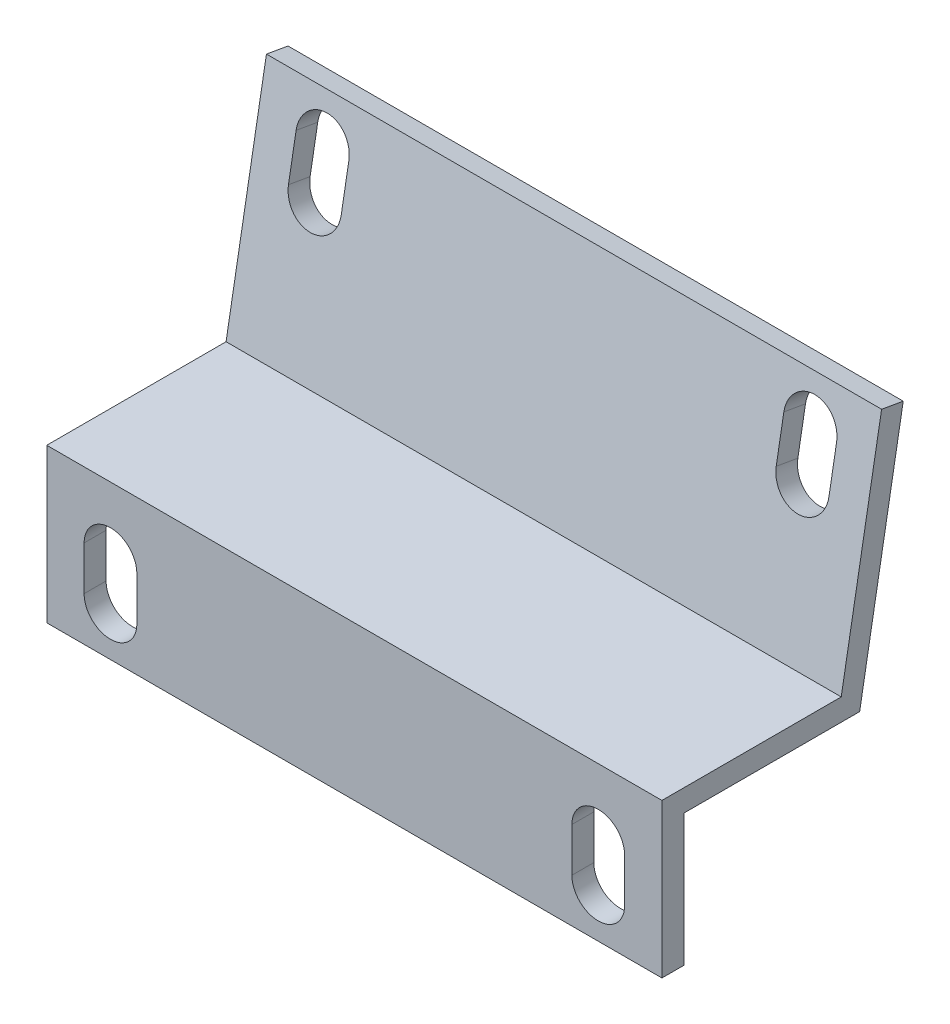
ISO-10303-21;
HEADER;
FILE_DESCRIPTION(('STEP AP214'),'2;1');
FILE_NAME('part.step','',(''),(''),'','','');
FILE_SCHEMA(('AUTOMOTIVE_DESIGN { 1 0 10303 214 1 1 1 1 }'));
ENDSEC;
DATA;
#1=APPLICATION_CONTEXT('core data for automotive mechanical design processes');
#2=APPLICATION_PROTOCOL_DEFINITION('international standard','automotive_design',2000,#1);
#3=PRODUCT_CONTEXT('',#1,'mechanical');
#4=PRODUCT('Part','Part','',(#3));
#5=PRODUCT_RELATED_PRODUCT_CATEGORY('part','',(#4));
#6=PRODUCT_DEFINITION_FORMATION('','',#4);
#7=PRODUCT_DEFINITION_CONTEXT('part definition',#1,'design');
#8=PRODUCT_DEFINITION('design','',#6,#7);
#9=PRODUCT_DEFINITION_SHAPE('','',#8);
#10=(LENGTH_UNIT() NAMED_UNIT(*) SI_UNIT(.MILLI.,.METRE.));
#11=(NAMED_UNIT(*) PLANE_ANGLE_UNIT() SI_UNIT($,.RADIAN.));
#12=(NAMED_UNIT(*) SI_UNIT($,.STERADIAN.) SOLID_ANGLE_UNIT());
#13=UNCERTAINTY_MEASURE_WITH_UNIT(LENGTH_MEASURE(1.E-05),#10,'distance_accuracy_value','');
#14=(GEOMETRIC_REPRESENTATION_CONTEXT(3) GLOBAL_UNCERTAINTY_ASSIGNED_CONTEXT((#13)) GLOBAL_UNIT_ASSIGNED_CONTEXT((#10,
#11,#12)) REPRESENTATION_CONTEXT('',''));
#15=CARTESIAN_POINT('',(0.,0.,0.));
#16=DIRECTION('',(0.,0.,1.));
#17=DIRECTION('',(1.,0.,0.));
#18=AXIS2_PLACEMENT_3D('',#15,#16,#17);
#19=CARTESIAN_POINT('',(70.,0.,0.));
#20=DIRECTION('',(0.,0.,1.));
#21=DIRECTION('',(0.,-1.,0.));
#22=AXIS2_PLACEMENT_3D('',#19,#20,#21);
#23=PLANE('',#22);
#24=DIRECTION('',(0.,-1.,0.));
#25=VECTOR('',#24,1.);
#26=CARTESIAN_POINT('',(4.25,0.,0.));
#27=LINE('',#26,#25);
#28=CARTESIAN_POINT('',(4.25,-5.,0.));
#29=VERTEX_POINT('',#28);
#30=CARTESIAN_POINT('',(4.25,-10.,0.));
#31=VERTEX_POINT('',#30);
#32=EDGE_CURVE('E328',#29,#31,#27,.T.);
#33=ORIENTED_EDGE('',*,*,#32,.T.);
#34=CARTESIAN_POINT('',(7.25,-10.,0.));
#35=DIRECTION('',(0.,0.,1.));
#36=DIRECTION('',(0.,-1.,0.));
#37=AXIS2_PLACEMENT_3D('',#34,#35,#36);
#38=CIRCLE('',#37,3.);
#39=CARTESIAN_POINT('',(10.25,-10.,0.));
#40=VERTEX_POINT('',#39);
#41=EDGE_CURVE('E331',#31,#40,#38,.T.);
#42=ORIENTED_EDGE('',*,*,#41,.T.);
#43=DIRECTION('',(0.,1.,0.));
#44=VECTOR('',#43,1.);
#45=CARTESIAN_POINT('',(10.25,0.,0.));
#46=LINE('',#45,#44);
#47=CARTESIAN_POINT('',(10.25,-5.,0.));
#48=VERTEX_POINT('',#47);
#49=EDGE_CURVE('E322',#40,#48,#46,.T.);
#50=ORIENTED_EDGE('',*,*,#49,.T.);
#51=CARTESIAN_POINT('',(7.25,-5.,0.));
#52=DIRECTION('',(0.,0.,1.));
#53=DIRECTION('',(0.,-1.,0.));
#54=AXIS2_PLACEMENT_3D('',#51,#52,#53);
#55=CIRCLE('',#54,3.);
#56=EDGE_CURVE('E325',#48,#29,#55,.T.);
#57=ORIENTED_EDGE('',*,*,#56,.T.);
#58=EDGE_LOOP('',(#33,#42,#50,#57));
#59=FACE_BOUND('',#58,.T.);
#60=DIRECTION('',(0.,-1.,0.));
#61=VECTOR('',#60,1.);
#62=CARTESIAN_POINT('',(59.75,0.,0.));
#63=LINE('',#62,#61);
#64=CARTESIAN_POINT('',(59.75,-5.,0.));
#65=VERTEX_POINT('',#64);
#66=CARTESIAN_POINT('',(59.75,-10.,0.));
#67=VERTEX_POINT('',#66);
#68=EDGE_CURVE('E316',#65,#67,#63,.T.);
#69=ORIENTED_EDGE('',*,*,#68,.T.);
#70=CARTESIAN_POINT('',(62.75,-10.,0.));
#71=DIRECTION('',(0.,0.,1.));
#72=DIRECTION('',(0.,-1.,0.));
#73=AXIS2_PLACEMENT_3D('',#70,#71,#72);
#74=CIRCLE('',#73,3.);
#75=CARTESIAN_POINT('',(65.75,-10.,0.));
#76=VERTEX_POINT('',#75);
#77=EDGE_CURVE('E319',#67,#76,#74,.T.);
#78=ORIENTED_EDGE('',*,*,#77,.T.);
#79=DIRECTION('',(0.,1.,0.));
#80=VECTOR('',#79,1.);
#81=CARTESIAN_POINT('',(65.75,0.,0.));
#82=LINE('',#81,#80);
#83=CARTESIAN_POINT('',(65.75,-5.,0.));
#84=VERTEX_POINT('',#83);
#85=EDGE_CURVE('E286',#76,#84,#82,.T.);
#86=ORIENTED_EDGE('',*,*,#85,.T.);
#87=CARTESIAN_POINT('',(62.75,-5.,0.));
#88=DIRECTION('',(0.,0.,1.));
#89=DIRECTION('',(0.,-1.,0.));
#90=AXIS2_PLACEMENT_3D('',#87,#88,#89);
#91=CIRCLE('',#90,3.);
#92=EDGE_CURVE('E313',#84,#65,#91,.T.);
#93=ORIENTED_EDGE('',*,*,#92,.T.);
#94=EDGE_LOOP('',(#69,#78,#86,#93));
#95=FACE_BOUND('',#94,.T.);
#96=DIRECTION('',(0.,1.,0.));
#97=VECTOR('',#96,1.);
#98=CARTESIAN_POINT('',(0.,0.,0.));
#99=LINE('',#98,#97);
#100=CARTESIAN_POINT('',(0.,-15.,0.));
#101=VERTEX_POINT('',#100);
#102=CARTESIAN_POINT('',(0.,0.,0.));
#103=VERTEX_POINT('',#102);
#104=EDGE_CURVE('E334',#101,#103,#99,.T.);
#105=ORIENTED_EDGE('',*,*,#104,.T.);
#106=DIRECTION('',(-1.,0.,0.));
#107=VECTOR('',#106,1.);
#108=CARTESIAN_POINT('',(70.,0.,0.));
#109=LINE('',#108,#107);
#110=CARTESIAN_POINT('',(70.,0.,0.));
#111=VERTEX_POINT('',#110);
#112=EDGE_CURVE('E11',#111,#103,#109,.T.);
#113=ORIENTED_EDGE('',*,*,#112,.F.);
#114=DIRECTION('',(0.,1.,0.));
#115=VECTOR('',#114,1.);
#116=CARTESIAN_POINT('',(70.,0.,0.));
#117=LINE('',#116,#115);
#118=CARTESIAN_POINT('',(70.,-15.,0.));
#119=VERTEX_POINT('',#118);
#120=EDGE_CURVE('E335',#119,#111,#117,.T.);
#121=ORIENTED_EDGE('',*,*,#120,.F.);
#122=DIRECTION('',(-1.,0.,0.));
#123=VECTOR('',#122,1.);
#124=CARTESIAN_POINT('',(70.,-15.,0.));
#125=LINE('',#124,#123);
#126=EDGE_CURVE('E353',#119,#101,#125,.T.);
#127=ORIENTED_EDGE('',*,*,#126,.T.);
#128=EDGE_LOOP('',(#105,#113,#121,#127));
#129=FACE_BOUND('',#128,.T.);
#130=ADVANCED_FACE('F41',(#59,#95,#129),#23,.F.);
#131=CARTESIAN_POINT('',(70.,0.,0.));
#132=DIRECTION('',(0.,1.,0.));
#133=DIRECTION('',(0.,0.,1.));
#134=AXIS2_PLACEMENT_3D('',#131,#132,#133);
#135=PLANE('',#134);
#136=DIRECTION('',(0.,0.,-1.));
#137=VECTOR('',#136,1.);
#138=CARTESIAN_POINT('',(0.,0.,0.));
#139=LINE('',#138,#137);
#140=CARTESIAN_POINT('',(0.,0.,-20.));
#141=VERTEX_POINT('',#140);
#142=EDGE_CURVE('E356',#103,#141,#139,.T.);
#143=ORIENTED_EDGE('',*,*,#142,.T.);
#144=DIRECTION('',(-1.,0.,0.));
#145=VECTOR('',#144,1.);
#146=CARTESIAN_POINT('',(70.,0.,-20.));
#147=LINE('',#146,#145);
#148=CARTESIAN_POINT('',(70.,0.,-20.));
#149=VERTEX_POINT('',#148);
#150=EDGE_CURVE('E48',#149,#141,#147,.T.);
#151=ORIENTED_EDGE('',*,*,#150,.F.);
#152=DIRECTION('',(0.,0.,-1.));
#153=VECTOR('',#152,1.);
#154=CARTESIAN_POINT('',(70.,0.,0.));
#155=LINE('',#154,#153);
#156=EDGE_CURVE('E338',#111,#149,#155,.T.);
#157=ORIENTED_EDGE('',*,*,#156,.F.);
#158=ORIENTED_EDGE('',*,*,#112,.T.);
#159=EDGE_LOOP('',(#143,#151,#157,#158));
#160=FACE_BOUND('',#159,.T.);
#161=ADVANCED_FACE('F412',(#160),#135,.F.);
#162=CARTESIAN_POINT('',(70.,0.,-20.));
#163=DIRECTION('',(0.,0.173648177666934,0.984807753012208));
#164=DIRECTION('',(0.,-0.984807753012208,0.173648177666934));
#165=AXIS2_PLACEMENT_3D('',#162,#163,#164);
#166=PLANE('',#165);
#167=CARTESIAN_POINT('',(7.25,23.1645389360579,-24.0845332100989));
#168=DIRECTION('',(0.,0.173648177666934,0.984807753012208));
#169=DIRECTION('',(0.,-0.984807753012208,0.173648177666934));
#170=AXIS2_PLACEMENT_3D('',#167,#168,#169);
#171=CIRCLE('',#170,3.);
#172=CARTESIAN_POINT('',(10.25,23.1645389360579,-24.0845332100989));
#173=VERTEX_POINT('',#172);
#174=CARTESIAN_POINT('',(4.25,23.1645389360579,-24.0845332100989));
#175=VERTEX_POINT('',#174);
#176=EDGE_CURVE('E264',#173,#175,#171,.T.);
#177=ORIENTED_EDGE('',*,*,#176,.T.);
#178=DIRECTION('',(0.,-0.984807753012207,0.173648177666934));
#179=VECTOR('',#178,1.);
#180=CARTESIAN_POINT('',(4.25,0.,-20.));
#181=LINE('',#180,#179);
#182=CARTESIAN_POINT('',(4.25,18.2405001709969,-23.2162923217642));
#183=VERTEX_POINT('',#182);
#184=EDGE_CURVE('E267',#175,#183,#181,.T.);
#185=ORIENTED_EDGE('',*,*,#184,.T.);
#186=CARTESIAN_POINT('',(7.25,18.2405001709969,-23.2162923217642));
#187=DIRECTION('',(0.,0.173648177666934,0.984807753012208));
#188=DIRECTION('',(0.,-0.984807753012208,0.173648177666934));
#189=AXIS2_PLACEMENT_3D('',#186,#187,#188);
#190=CIRCLE('',#189,3.);
#191=CARTESIAN_POINT('',(10.25,18.2405001709969,-23.2162923217642));
#192=VERTEX_POINT('',#191);
#193=EDGE_CURVE('E261',#183,#192,#190,.T.);
#194=ORIENTED_EDGE('',*,*,#193,.T.);
#195=DIRECTION('',(0.,-0.984807753012207,0.173648177666934));
#196=VECTOR('',#195,1.);
#197=CARTESIAN_POINT('',(10.25,0.,-20.));
#198=LINE('',#197,#196);
#199=EDGE_CURVE('E206',#173,#192,#198,.T.);
#200=ORIENTED_EDGE('',*,*,#199,.F.);
#201=EDGE_LOOP('',(#177,#185,#194,#200));
#202=FACE_BOUND('',#201,.T.);
#203=CARTESIAN_POINT('',(62.75,23.1645389360579,-24.0845332100989));
#204=DIRECTION('',(0.,0.173648177666934,0.984807753012208));
#205=DIRECTION('',(0.,-0.984807753012208,0.173648177666934));
#206=AXIS2_PLACEMENT_3D('',#203,#204,#205);
#207=CIRCLE('',#206,3.);
#208=CARTESIAN_POINT('',(65.75,23.1645389360579,-24.0845332100989));
#209=VERTEX_POINT('',#208);
#210=CARTESIAN_POINT('',(59.75,23.1645389360579,-24.0845332100989));
#211=VERTEX_POINT('',#210);
#212=EDGE_CURVE('E255',#209,#211,#207,.T.);
#213=ORIENTED_EDGE('',*,*,#212,.T.);
#214=DIRECTION('',(0.,-0.984807753012207,0.173648177666934));
#215=VECTOR('',#214,1.);
#216=CARTESIAN_POINT('',(59.75,0.,-20.));
#217=LINE('',#216,#215);
#218=CARTESIAN_POINT('',(59.75,18.2405001709969,-23.2162923217642));
#219=VERTEX_POINT('',#218);
#220=EDGE_CURVE('E258',#211,#219,#217,.T.);
#221=ORIENTED_EDGE('',*,*,#220,.T.);
#222=CARTESIAN_POINT('',(62.75,18.2405001709969,-23.2162923217642));
#223=DIRECTION('',(0.,0.173648177666934,0.984807753012208));
#224=DIRECTION('',(0.,-0.984807753012208,0.173648177666934));
#225=AXIS2_PLACEMENT_3D('',#222,#223,#224);
#226=CIRCLE('',#225,3.);
#227=CARTESIAN_POINT('',(65.75,18.2405001709969,-23.2162923217642));
#228=VERTEX_POINT('',#227);
#229=EDGE_CURVE('E230',#219,#228,#226,.T.);
#230=ORIENTED_EDGE('',*,*,#229,.T.);
#231=DIRECTION('',(0.,-0.984807753012207,0.173648177666934));
#232=VECTOR('',#231,1.);
#233=CARTESIAN_POINT('',(65.75,0.,-20.));
#234=LINE('',#233,#232);
#235=EDGE_CURVE('E253',#209,#228,#234,.T.);
#236=ORIENTED_EDGE('',*,*,#235,.F.);
#237=EDGE_LOOP('',(#213,#221,#230,#236));
#238=FACE_BOUND('',#237,.T.);
#239=DIRECTION('',(0.,0.984807753012208,-0.173648177666934));
#240=VECTOR('',#239,1.);
#241=CARTESIAN_POINT('',(0.,0.,-20.));
#242=LINE('',#241,#240);
#243=CARTESIAN_POINT('',(0.,28.115152985752,-24.9574600381344));
#244=VERTEX_POINT('',#243);
#245=EDGE_CURVE('E358',#141,#244,#242,.T.);
#246=ORIENTED_EDGE('',*,*,#245,.T.);
#247=DIRECTION('',(-1.,0.,0.));
#248=VECTOR('',#247,1.);
#249=CARTESIAN_POINT('',(70.,28.115152985752,-24.9574600381344));
#250=LINE('',#249,#248);
#251=CARTESIAN_POINT('',(70.,28.115152985752,-24.9574600381344));
#252=VERTEX_POINT('',#251);
#253=EDGE_CURVE('E383',#252,#244,#250,.T.);
#254=ORIENTED_EDGE('',*,*,#253,.F.);
#255=DIRECTION('',(0.,0.984807753012208,-0.173648177666934));
#256=VECTOR('',#255,1.);
#257=CARTESIAN_POINT('',(70.,0.,-20.));
#258=LINE('',#257,#256);
#259=EDGE_CURVE('E341',#149,#252,#258,.T.);
#260=ORIENTED_EDGE('',*,*,#259,.F.);
#261=ORIENTED_EDGE('',*,*,#150,.T.);
#262=EDGE_LOOP('',(#246,#254,#260,#261));
#263=FACE_BOUND('',#262,.T.);
#264=ADVANCED_FACE('F390',(#202,#238,#263),#166,.F.);
#265=CARTESIAN_POINT('',(70.,28.5492734299194,-22.4954406556038));
#266=DIRECTION('',(0.,-0.984807753012208,0.173648177666932));
#267=DIRECTION('',(0.,-0.173648177666932,-0.984807753012208));
#268=AXIS2_PLACEMENT_3D('',#265,#266,#267);
#269=PLANE('',#268);
#270=DIRECTION('',(0.,0.173648177666932,0.984807753012208));
#271=VECTOR('',#270,1.);
#272=CARTESIAN_POINT('',(0.,28.5492734299194,-22.4954406556038));
#273=LINE('',#272,#271);
#274=CARTESIAN_POINT('',(0.,28.5492734299194,-22.4954406556038));
#275=VERTEX_POINT('',#274);
#276=EDGE_CURVE('E360',#244,#275,#273,.T.);
#277=ORIENTED_EDGE('',*,*,#276,.T.);
#278=DIRECTION('',(-1.,0.,0.));
#279=VECTOR('',#278,1.);
#280=CARTESIAN_POINT('',(70.,28.5492734299194,-22.4954406556038));
#281=LINE('',#280,#279);
#282=CARTESIAN_POINT('',(70.,28.5492734299194,-22.4954406556038));
#283=VERTEX_POINT('',#282);
#284=EDGE_CURVE('E380',#283,#275,#281,.T.);
#285=ORIENTED_EDGE('',*,*,#284,.F.);
#286=DIRECTION('',(0.,0.173648177666932,0.984807753012208));
#287=VECTOR('',#286,1.);
#288=CARTESIAN_POINT('',(70.,28.5492734299194,-22.4954406556038));
#289=LINE('',#288,#287);
#290=EDGE_CURVE('E343',#252,#283,#289,.T.);
#291=ORIENTED_EDGE('',*,*,#290,.F.);
#292=ORIENTED_EDGE('',*,*,#253,.T.);
#293=EDGE_LOOP('',(#277,#285,#291,#292));
#294=FACE_BOUND('',#293,.T.);
#295=ADVANCED_FACE('F401',(#294),#269,.F.);
#296=CARTESIAN_POINT('',(70.,2.5,-17.9022509220568));
#297=DIRECTION('',(0.,-0.173648177666934,-0.984807753012208));
#298=DIRECTION('',(0.,0.984807753012208,-0.173648177666934));
#299=AXIS2_PLACEMENT_3D('',#296,#297,#298);
#300=PLANE('',#299);
#301=CARTESIAN_POINT('',(7.25,18.6746206151642,-20.7542729392337));
#302=DIRECTION('',(0.,0.173648177666934,0.984807753012208));
#303=DIRECTION('',(0.,-0.984807753012208,0.173648177666934));
#304=AXIS2_PLACEMENT_3D('',#301,#302,#303);
#305=CIRCLE('',#304,3.);
#306=CARTESIAN_POINT('',(4.25,18.6746206151642,-20.7542729392337));
#307=VERTEX_POINT('',#306);
#308=CARTESIAN_POINT('',(10.25,18.6746206151642,-20.7542729392337));
#309=VERTEX_POINT('',#308);
#310=EDGE_CURVE('E213',#307,#309,#305,.T.);
#311=ORIENTED_EDGE('',*,*,#310,.F.);
#312=DIRECTION('',(0.,-0.984807753012208,0.173648177666934));
#313=VECTOR('',#312,1.);
#314=CARTESIAN_POINT('',(4.25,-2.98608098908942,-16.9349068253286));
#315=LINE('',#314,#313);
#316=CARTESIAN_POINT('',(4.25,23.5986593802252,-21.6225138275684));
#317=VERTEX_POINT('',#316);
#318=EDGE_CURVE('E218',#317,#307,#315,.T.);
#319=ORIENTED_EDGE('',*,*,#318,.F.);
#320=CARTESIAN_POINT('',(7.25,23.5986593802252,-21.6225138275683));
#321=DIRECTION('',(0.,0.173648177666934,0.984807753012208));
#322=DIRECTION('',(0.,-0.984807753012208,0.173648177666934));
#323=AXIS2_PLACEMENT_3D('',#320,#321,#322);
#324=CIRCLE('',#323,3.);
#325=CARTESIAN_POINT('',(10.25,23.5986593802252,-21.6225138275684));
#326=VERTEX_POINT('',#325);
#327=EDGE_CURVE('E223',#326,#317,#324,.T.);
#328=ORIENTED_EDGE('',*,*,#327,.F.);
#329=DIRECTION('',(0.,-0.984807753012208,0.173648177666934));
#330=VECTOR('',#329,1.);
#331=CARTESIAN_POINT('',(10.25,-2.98608098908942,-16.9349068253286));
#332=LINE('',#331,#330);
#333=EDGE_CURVE('E203',#326,#309,#332,.T.);
#334=ORIENTED_EDGE('',*,*,#333,.T.);
#335=EDGE_LOOP('',(#311,#319,#328,#334));
#336=FACE_BOUND('',#335,.T.);
#337=CARTESIAN_POINT('',(62.75,18.6746206151642,-20.7542729392337));
#338=DIRECTION('',(0.,0.173648177666934,0.984807753012208));
#339=DIRECTION('',(0.,-0.984807753012208,0.173648177666934));
#340=AXIS2_PLACEMENT_3D('',#337,#338,#339);
#341=CIRCLE('',#340,3.);
#342=CARTESIAN_POINT('',(59.75,18.6746206151642,-20.7542729392337));
#343=VERTEX_POINT('',#342);
#344=CARTESIAN_POINT('',(65.75,18.6746206151642,-20.7542729392337));
#345=VERTEX_POINT('',#344);
#346=EDGE_CURVE('E235',#343,#345,#341,.T.);
#347=ORIENTED_EDGE('',*,*,#346,.F.);
#348=DIRECTION('',(0.,-0.984807753012208,0.173648177666934));
#349=VECTOR('',#348,1.);
#350=CARTESIAN_POINT('',(59.75,-2.98608098908942,-16.9349068253286));
#351=LINE('',#350,#349);
#352=CARTESIAN_POINT('',(59.75,23.5986593802252,-21.6225138275684));
#353=VERTEX_POINT('',#352);
#354=EDGE_CURVE('E233',#353,#343,#351,.T.);
#355=ORIENTED_EDGE('',*,*,#354,.F.);
#356=CARTESIAN_POINT('',(62.75,23.5986593802252,-21.6225138275683));
#357=DIRECTION('',(0.,0.173648177666934,0.984807753012208));
#358=DIRECTION('',(0.,-0.984807753012208,0.173648177666934));
#359=AXIS2_PLACEMENT_3D('',#356,#357,#358);
#360=CIRCLE('',#359,3.);
#361=CARTESIAN_POINT('',(65.75,23.5986593802252,-21.6225138275684));
#362=VERTEX_POINT('',#361);
#363=EDGE_CURVE('E240',#362,#353,#360,.T.);
#364=ORIENTED_EDGE('',*,*,#363,.F.);
#365=DIRECTION('',(0.,-0.984807753012208,0.173648177666934));
#366=VECTOR('',#365,1.);
#367=CARTESIAN_POINT('',(65.75,-2.98608098908942,-16.9349068253286));
#368=LINE('',#367,#366);
#369=EDGE_CURVE('E237',#362,#345,#368,.T.);
#370=ORIENTED_EDGE('',*,*,#369,.T.);
#371=EDGE_LOOP('',(#347,#355,#364,#370));
#372=FACE_BOUND('',#371,.T.);
#373=DIRECTION('',(0.,-0.984807753012207,0.173648177666934));
#374=VECTOR('',#373,1.);
#375=CARTESIAN_POINT('',(0.,2.5,-17.9022509220568));
#376=LINE('',#375,#374);
#377=CARTESIAN_POINT('',(0.,2.5,-17.9022509220568));
#378=VERTEX_POINT('',#377);
#379=EDGE_CURVE('E362',#275,#378,#376,.T.);
#380=ORIENTED_EDGE('',*,*,#379,.T.);
#381=DIRECTION('',(-1.,0.,0.));
#382=VECTOR('',#381,1.);
#383=CARTESIAN_POINT('',(70.,2.5,-17.9022509220568));
#384=LINE('',#383,#382);
#385=CARTESIAN_POINT('',(70.,2.5,-17.9022509220568));
#386=VERTEX_POINT('',#385);
#387=EDGE_CURVE('E377',#386,#378,#384,.T.);
#388=ORIENTED_EDGE('',*,*,#387,.F.);
#389=DIRECTION('',(0.,-0.984807753012207,0.173648177666934));
#390=VECTOR('',#389,1.);
#391=CARTESIAN_POINT('',(70.,2.5,-17.9022509220568));
#392=LINE('',#391,#390);
#393=EDGE_CURVE('E345',#283,#386,#392,.T.);
#394=ORIENTED_EDGE('',*,*,#393,.F.);
#395=ORIENTED_EDGE('',*,*,#284,.T.);
#396=EDGE_LOOP('',(#380,#388,#394,#395));
#397=FACE_BOUND('',#396,.T.);
#398=ADVANCED_FACE('F220',(#336,#372,#397),#300,.F.);
#399=CARTESIAN_POINT('',(70.,2.5,2.5));
#400=DIRECTION('',(0.,-1.,0.));
#401=DIRECTION('',(0.,0.,-1.));
#402=AXIS2_PLACEMENT_3D('',#399,#400,#401);
#403=PLANE('',#402);
#404=DIRECTION('',(0.,0.,1.));
#405=VECTOR('',#404,1.);
#406=CARTESIAN_POINT('',(0.,2.5,2.5));
#407=LINE('',#406,#405);
#408=CARTESIAN_POINT('',(0.,2.5,2.5));
#409=VERTEX_POINT('',#408);
#410=EDGE_CURVE('E364',#378,#409,#407,.T.);
#411=ORIENTED_EDGE('',*,*,#410,.T.);
#412=DIRECTION('',(-1.,0.,0.));
#413=VECTOR('',#412,1.);
#414=CARTESIAN_POINT('',(70.,2.5,2.5));
#415=LINE('',#414,#413);
#416=CARTESIAN_POINT('',(70.,2.5,2.5));
#417=VERTEX_POINT('',#416);
#418=EDGE_CURVE('E374',#417,#409,#415,.T.);
#419=ORIENTED_EDGE('',*,*,#418,.F.);
#420=DIRECTION('',(0.,0.,1.));
#421=VECTOR('',#420,1.);
#422=CARTESIAN_POINT('',(70.,2.5,2.5));
#423=LINE('',#422,#421);
#424=EDGE_CURVE('E347',#386,#417,#423,.T.);
#425=ORIENTED_EDGE('',*,*,#424,.F.);
#426=ORIENTED_EDGE('',*,*,#387,.T.);
#427=EDGE_LOOP('',(#411,#419,#425,#426));
#428=FACE_BOUND('',#427,.T.);
#429=ADVANCED_FACE('F425',(#428),#403,.F.);
#430=CARTESIAN_POINT('',(70.,2.5,2.5));
#431=DIRECTION('',(0.,0.,-1.));
#432=DIRECTION('',(0.,1.,0.));
#433=AXIS2_PLACEMENT_3D('',#430,#431,#432);
#434=PLANE('',#433);
#435=DIRECTION('',(0.,1.,0.));
#436=VECTOR('',#435,1.);
#437=CARTESIAN_POINT('',(10.25,-10.,2.5));
#438=LINE('',#437,#436);
#439=CARTESIAN_POINT('',(10.25,-10.,2.5));
#440=VERTEX_POINT('',#439);
#441=CARTESIAN_POINT('',(10.25,-5.,2.5));
#442=VERTEX_POINT('',#441);
#443=EDGE_CURVE('E273',#440,#442,#438,.T.);
#444=ORIENTED_EDGE('',*,*,#443,.F.);
#445=CARTESIAN_POINT('',(7.25,-10.,2.5));
#446=DIRECTION('',(0.,0.,1.));
#447=DIRECTION('',(1.,0.,0.));
#448=AXIS2_PLACEMENT_3D('',#445,#446,#447);
#449=CIRCLE('',#448,3.);
#450=CARTESIAN_POINT('',(4.25,-10.,2.5));
#451=VERTEX_POINT('',#450);
#452=EDGE_CURVE('E271',#451,#440,#449,.T.);
#453=ORIENTED_EDGE('',*,*,#452,.F.);
#454=DIRECTION('',(0.,-1.,0.));
#455=VECTOR('',#454,1.);
#456=CARTESIAN_POINT('',(4.25,-10.,2.5));
#457=LINE('',#456,#455);
#458=CARTESIAN_POINT('',(4.25,-5.,2.5));
#459=VERTEX_POINT('',#458);
#460=EDGE_CURVE('E280',#459,#451,#457,.T.);
#461=ORIENTED_EDGE('',*,*,#460,.F.);
#462=CARTESIAN_POINT('',(7.25,-5.,2.5));
#463=DIRECTION('',(0.,0.,1.));
#464=DIRECTION('',(1.,0.,0.));
#465=AXIS2_PLACEMENT_3D('',#462,#463,#464);
#466=CIRCLE('',#465,3.);
#467=EDGE_CURVE('E277',#442,#459,#466,.T.);
#468=ORIENTED_EDGE('',*,*,#467,.F.);
#469=EDGE_LOOP('',(#444,#453,#461,#468));
#470=FACE_BOUND('',#469,.T.);
#471=DIRECTION('',(0.,1.,0.));
#472=VECTOR('',#471,1.);
#473=CARTESIAN_POINT('',(65.75,-10.,2.5));
#474=LINE('',#473,#472);
#475=CARTESIAN_POINT('',(65.75,-10.,2.5));
#476=VERTEX_POINT('',#475);
#477=CARTESIAN_POINT('',(65.75,-5.,2.5));
#478=VERTEX_POINT('',#477);
#479=EDGE_CURVE('E307',#476,#478,#474,.T.);
#480=ORIENTED_EDGE('',*,*,#479,.F.);
#481=CARTESIAN_POINT('',(62.75,-10.,2.5));
#482=DIRECTION('',(0.,0.,1.));
#483=DIRECTION('',(-1.,0.,0.));
#484=AXIS2_PLACEMENT_3D('',#481,#482,#483);
#485=CIRCLE('',#484,3.);
#486=CARTESIAN_POINT('',(59.75,-10.,2.5));
#487=VERTEX_POINT('',#486);
#488=EDGE_CURVE('E274',#487,#476,#485,.T.);
#489=ORIENTED_EDGE('',*,*,#488,.F.);
#490=DIRECTION('',(0.,-1.,0.));
#491=VECTOR('',#490,1.);
#492=CARTESIAN_POINT('',(59.75,-10.,2.5));
#493=LINE('',#492,#491);
#494=CARTESIAN_POINT('',(59.75,-5.,2.5));
#495=VERTEX_POINT('',#494);
#496=EDGE_CURVE('E296',#495,#487,#493,.T.);
#497=ORIENTED_EDGE('',*,*,#496,.F.);
#498=CARTESIAN_POINT('',(62.75,-5.,2.5));
#499=DIRECTION('',(0.,0.,1.));
#500=DIRECTION('',(-1.,0.,0.));
#501=AXIS2_PLACEMENT_3D('',#498,#499,#500);
#502=CIRCLE('',#501,3.);
#503=EDGE_CURVE('E304',#478,#495,#502,.T.);
#504=ORIENTED_EDGE('',*,*,#503,.F.);
#505=EDGE_LOOP('',(#480,#489,#497,#504));
#506=FACE_BOUND('',#505,.T.);
#507=DIRECTION('',(0.,-1.,0.));
#508=VECTOR('',#507,1.);
#509=CARTESIAN_POINT('',(0.,2.5,2.5));
#510=LINE('',#509,#508);
#511=CARTESIAN_POINT('',(0.,-15.,2.5));
#512=VERTEX_POINT('',#511);
#513=EDGE_CURVE('E366',#409,#512,#510,.T.);
#514=ORIENTED_EDGE('',*,*,#513,.T.);
#515=DIRECTION('',(-1.,0.,0.));
#516=VECTOR('',#515,1.);
#517=CARTESIAN_POINT('',(70.,-15.,2.5));
#518=LINE('',#517,#516);
#519=CARTESIAN_POINT('',(70.,-15.,2.5));
#520=VERTEX_POINT('',#519);
#521=EDGE_CURVE('E371',#520,#512,#518,.T.);
#522=ORIENTED_EDGE('',*,*,#521,.F.);
#523=DIRECTION('',(0.,-1.,0.));
#524=VECTOR('',#523,1.);
#525=CARTESIAN_POINT('',(70.,2.5,2.5));
#526=LINE('',#525,#524);
#527=EDGE_CURVE('E349',#417,#520,#526,.T.);
#528=ORIENTED_EDGE('',*,*,#527,.F.);
#529=ORIENTED_EDGE('',*,*,#418,.T.);
#530=EDGE_LOOP('',(#514,#522,#528,#529));
#531=FACE_BOUND('',#530,.T.);
#532=ADVANCED_FACE('F423',(#470,#506,#531),#434,.F.);
#533=CARTESIAN_POINT('',(70.,-15.,2.5));
#534=DIRECTION('',(0.,1.,0.));
#535=DIRECTION('',(0.,0.,1.));
#536=AXIS2_PLACEMENT_3D('',#533,#534,#535);
#537=PLANE('',#536);
#538=DIRECTION('',(0.,0.,-1.));
#539=VECTOR('',#538,1.);
#540=CARTESIAN_POINT('',(0.,-15.,2.5));
#541=LINE('',#540,#539);
#542=EDGE_CURVE('E339',#512,#101,#541,.T.);
#543=ORIENTED_EDGE('',*,*,#542,.T.);
#544=ORIENTED_EDGE('',*,*,#126,.F.);
#545=DIRECTION('',(0.,0.,-1.));
#546=VECTOR('',#545,1.);
#547=CARTESIAN_POINT('',(70.,-15.,2.5));
#548=LINE('',#547,#546);
#549=EDGE_CURVE('E351',#520,#119,#548,.T.);
#550=ORIENTED_EDGE('',*,*,#549,.F.);
#551=ORIENTED_EDGE('',*,*,#521,.T.);
#552=EDGE_LOOP('',(#543,#544,#550,#551));
#553=FACE_BOUND('',#552,.T.);
#554=ADVANCED_FACE('F418',(#553),#537,.F.);
#555=CARTESIAN_POINT('',(70.,0.,0.));
#556=DIRECTION('',(1.,0.,0.));
#557=DIRECTION('',(0.,0.,-1.));
#558=AXIS2_PLACEMENT_3D('',#555,#556,#557);
#559=PLANE('',#558);
#560=ORIENTED_EDGE('',*,*,#120,.T.);
#561=ORIENTED_EDGE('',*,*,#156,.T.);
#562=ORIENTED_EDGE('',*,*,#259,.T.);
#563=ORIENTED_EDGE('',*,*,#290,.T.);
#564=ORIENTED_EDGE('',*,*,#393,.T.);
#565=ORIENTED_EDGE('',*,*,#424,.T.);
#566=ORIENTED_EDGE('',*,*,#527,.T.);
#567=ORIENTED_EDGE('',*,*,#549,.T.);
#568=EDGE_LOOP('',(#560,#561,#562,#563,#564,#565,#566,#567));
#569=FACE_BOUND('',#568,.T.);
#570=ADVANCED_FACE('F408',(#569),#559,.T.);
#571=CARTESIAN_POINT('',(0.,0.,0.));
#572=DIRECTION('',(1.,0.,0.));
#573=DIRECTION('',(0.,0.,-1.));
#574=AXIS2_PLACEMENT_3D('',#571,#572,#573);
#575=PLANE('',#574);
#576=ORIENTED_EDGE('',*,*,#104,.F.);
#577=ORIENTED_EDGE('',*,*,#542,.F.);
#578=ORIENTED_EDGE('',*,*,#513,.F.);
#579=ORIENTED_EDGE('',*,*,#410,.F.);
#580=ORIENTED_EDGE('',*,*,#379,.F.);
#581=ORIENTED_EDGE('',*,*,#276,.F.);
#582=ORIENTED_EDGE('',*,*,#245,.F.);
#583=ORIENTED_EDGE('',*,*,#142,.F.);
#584=EDGE_LOOP('',(#576,#577,#578,#579,#580,#581,#582,#583));
#585=FACE_BOUND('',#584,.T.);
#586=ADVANCED_FACE('F396',(#585),#575,.F.);
#587=CARTESIAN_POINT('',(62.75,-10.,-67.5));
#588=DIRECTION('',(0.,0.,1.));
#589=DIRECTION('',(1.,0.,0.));
#590=AXIS2_PLACEMENT_3D('',#587,#588,#589);
#591=CYLINDRICAL_SURFACE('',#590,3.);
#592=DIRECTION('',(0.,0.,1.));
#593=VECTOR('',#592,1.);
#594=CARTESIAN_POINT('',(59.75,-10.,-67.5));
#595=LINE('',#594,#593);
#596=EDGE_CURVE('E270',#67,#487,#595,.T.);
#597=ORIENTED_EDGE('',*,*,#596,.T.);
#598=ORIENTED_EDGE('',*,*,#488,.T.);
#599=DIRECTION('',(0.,0.,1.));
#600=VECTOR('',#599,1.);
#601=CARTESIAN_POINT('',(65.75,-10.,-67.5));
#602=LINE('',#601,#600);
#603=EDGE_CURVE('E293',#76,#476,#602,.T.);
#604=ORIENTED_EDGE('',*,*,#603,.F.);
#605=ORIENTED_EDGE('',*,*,#77,.F.);
#606=EDGE_LOOP('',(#597,#598,#604,#605));
#607=FACE_BOUND('',#606,.T.);
#608=ADVANCED_FACE('F458',(#607),#591,.F.);
#609=CARTESIAN_POINT('',(59.75,-10.,-67.5));
#610=DIRECTION('',(-1.,0.,0.));
#611=DIRECTION('',(0.,-1.,0.));
#612=AXIS2_PLACEMENT_3D('',#609,#610,#611);
#613=PLANE('',#612);
#614=DIRECTION('',(0.,0.,1.));
#615=VECTOR('',#614,1.);
#616=CARTESIAN_POINT('',(59.75,-5.,-67.5));
#617=LINE('',#616,#615);
#618=EDGE_CURVE('E299',#65,#495,#617,.T.);
#619=ORIENTED_EDGE('',*,*,#618,.T.);
#620=ORIENTED_EDGE('',*,*,#496,.T.);
#621=ORIENTED_EDGE('',*,*,#596,.F.);
#622=ORIENTED_EDGE('',*,*,#68,.F.);
#623=EDGE_LOOP('',(#619,#620,#621,#622));
#624=FACE_BOUND('',#623,.T.);
#625=ADVANCED_FACE('F448',(#624),#613,.F.);
#626=CARTESIAN_POINT('',(62.75,-5.,-67.5));
#627=DIRECTION('',(0.,0.,1.));
#628=DIRECTION('',(1.,0.,0.));
#629=AXIS2_PLACEMENT_3D('',#626,#627,#628);
#630=CYLINDRICAL_SURFACE('',#629,3.);
#631=DIRECTION('',(0.,0.,1.));
#632=VECTOR('',#631,1.);
#633=CARTESIAN_POINT('',(65.75,-5.,-67.5));
#634=LINE('',#633,#632);
#635=EDGE_CURVE('E297',#84,#478,#634,.T.);
#636=ORIENTED_EDGE('',*,*,#635,.T.);
#637=ORIENTED_EDGE('',*,*,#503,.T.);
#638=ORIENTED_EDGE('',*,*,#618,.F.);
#639=ORIENTED_EDGE('',*,*,#92,.F.);
#640=EDGE_LOOP('',(#636,#637,#638,#639));
#641=FACE_BOUND('',#640,.T.);
#642=ADVANCED_FACE('F450',(#641),#630,.F.);
#643=CARTESIAN_POINT('',(65.75,-10.,-67.5));
#644=DIRECTION('',(1.,0.,0.));
#645=DIRECTION('',(0.,0.,-1.));
#646=AXIS2_PLACEMENT_3D('',#643,#644,#645);
#647=PLANE('',#646);
#648=ORIENTED_EDGE('',*,*,#603,.T.);
#649=ORIENTED_EDGE('',*,*,#479,.T.);
#650=ORIENTED_EDGE('',*,*,#635,.F.);
#651=ORIENTED_EDGE('',*,*,#85,.F.);
#652=EDGE_LOOP('',(#648,#649,#650,#651));
#653=FACE_BOUND('',#652,.T.);
#654=ADVANCED_FACE('F460',(#653),#647,.F.);
#655=CARTESIAN_POINT('',(7.25,-10.,-67.5));
#656=DIRECTION('',(0.,0.,1.));
#657=DIRECTION('',(1.,0.,0.));
#658=AXIS2_PLACEMENT_3D('',#655,#656,#657);
#659=CYLINDRICAL_SURFACE('',#658,3.);
#660=DIRECTION('',(0.,0.,1.));
#661=VECTOR('',#660,1.);
#662=CARTESIAN_POINT('',(4.25,-10.,-67.5));
#663=LINE('',#662,#661);
#664=EDGE_CURVE('E284',#31,#451,#663,.T.);
#665=ORIENTED_EDGE('',*,*,#664,.T.);
#666=ORIENTED_EDGE('',*,*,#452,.T.);
#667=DIRECTION('',(0.,0.,1.));
#668=VECTOR('',#667,1.);
#669=CARTESIAN_POINT('',(10.25,-10.,-67.5));
#670=LINE('',#669,#668);
#671=EDGE_CURVE('E283',#40,#440,#670,.T.);
#672=ORIENTED_EDGE('',*,*,#671,.F.);
#673=ORIENTED_EDGE('',*,*,#41,.F.);
#674=EDGE_LOOP('',(#665,#666,#672,#673));
#675=FACE_BOUND('',#674,.T.);
#676=ADVANCED_FACE('F462',(#675),#659,.F.);
#677=CARTESIAN_POINT('',(4.25,-10.,-67.5));
#678=DIRECTION('',(-1.,0.,0.));
#679=DIRECTION('',(0.,-1.,0.));
#680=AXIS2_PLACEMENT_3D('',#677,#678,#679);
#681=PLANE('',#680);
#682=DIRECTION('',(0.,0.,1.));
#683=VECTOR('',#682,1.);
#684=CARTESIAN_POINT('',(4.25,-5.,-67.5));
#685=LINE('',#684,#683);
#686=EDGE_CURVE('E287',#29,#459,#685,.T.);
#687=ORIENTED_EDGE('',*,*,#686,.T.);
#688=ORIENTED_EDGE('',*,*,#460,.T.);
#689=ORIENTED_EDGE('',*,*,#664,.F.);
#690=ORIENTED_EDGE('',*,*,#32,.F.);
#691=EDGE_LOOP('',(#687,#688,#689,#690));
#692=FACE_BOUND('',#691,.T.);
#693=ADVANCED_FACE('F468',(#692),#681,.F.);
#694=CARTESIAN_POINT('',(7.25,-5.,-67.5));
#695=DIRECTION('',(0.,0.,1.));
#696=DIRECTION('',(1.,0.,0.));
#697=AXIS2_PLACEMENT_3D('',#694,#695,#696);
#698=CYLINDRICAL_SURFACE('',#697,3.);
#699=DIRECTION('',(0.,0.,1.));
#700=VECTOR('',#699,1.);
#701=CARTESIAN_POINT('',(10.25,-5.,-67.5));
#702=LINE('',#701,#700);
#703=EDGE_CURVE('E289',#48,#442,#702,.T.);
#704=ORIENTED_EDGE('',*,*,#703,.T.);
#705=ORIENTED_EDGE('',*,*,#467,.T.);
#706=ORIENTED_EDGE('',*,*,#686,.F.);
#707=ORIENTED_EDGE('',*,*,#56,.F.);
#708=EDGE_LOOP('',(#704,#705,#706,#707));
#709=FACE_BOUND('',#708,.T.);
#710=ADVANCED_FACE('F531',(#709),#698,.F.);
#711=CARTESIAN_POINT('',(10.25,-10.,-67.5));
#712=DIRECTION('',(1.,0.,0.));
#713=DIRECTION('',(0.,1.,0.));
#714=AXIS2_PLACEMENT_3D('',#711,#712,#713);
#715=PLANE('',#714);
#716=ORIENTED_EDGE('',*,*,#671,.T.);
#717=ORIENTED_EDGE('',*,*,#443,.T.);
#718=ORIENTED_EDGE('',*,*,#703,.F.);
#719=ORIENTED_EDGE('',*,*,#49,.F.);
#720=EDGE_LOOP('',(#716,#717,#718,#719));
#721=FACE_BOUND('',#720,.T.);
#722=ADVANCED_FACE('F541',(#721),#715,.F.);
#723=CARTESIAN_POINT('',(59.75,-4.72256276575876,-26.7829843554506));
#724=DIRECTION('',(-1.,0.,0.));
#725=DIRECTION('',(0.,0.,1.));
#726=AXIS2_PLACEMENT_3D('',#723,#724,#725);
#727=PLANE('',#726);
#728=DIRECTION('',(0.,0.173648177666934,0.984807753012208));
#729=VECTOR('',#728,1.);
#730=CARTESIAN_POINT('',(59.75,21.8621776035559,-31.4705913576904));
#731=LINE('',#730,#729);
#732=EDGE_CURVE('E244',#211,#353,#731,.T.);
#733=ORIENTED_EDGE('',*,*,#732,.T.);
#734=ORIENTED_EDGE('',*,*,#354,.T.);
#735=DIRECTION('',(0.,0.173648177666934,0.984807753012208));
#736=VECTOR('',#735,1.);
#737=CARTESIAN_POINT('',(59.75,16.9381388384949,-30.6023504693558));
#738=LINE('',#737,#736);
#739=EDGE_CURVE('E243',#219,#343,#738,.T.);
#740=ORIENTED_EDGE('',*,*,#739,.F.);
#741=ORIENTED_EDGE('',*,*,#220,.F.);
#742=EDGE_LOOP('',(#733,#734,#740,#741));
#743=FACE_BOUND('',#742,.T.);
#744=ADVANCED_FACE('F551',(#743),#727,.F.);
#745=CARTESIAN_POINT('',(62.75,21.8621776035559,-31.4705913576904));
#746=DIRECTION('',(0.,0.173648177666934,0.984807753012208));
#747=DIRECTION('',(0.,-0.984807753012208,0.173648177666934));
#748=AXIS2_PLACEMENT_3D('',#745,#746,#747);
#749=CYLINDRICAL_SURFACE('',#748,3.);
#750=DIRECTION('',(0.,0.173648177666934,0.984807753012208));
#751=VECTOR('',#750,1.);
#752=CARTESIAN_POINT('',(65.75,21.8621776035559,-31.4705913576904));
#753=LINE('',#752,#751);
#754=EDGE_CURVE('E246',#209,#362,#753,.T.);
#755=ORIENTED_EDGE('',*,*,#754,.T.);
#756=ORIENTED_EDGE('',*,*,#363,.T.);
#757=ORIENTED_EDGE('',*,*,#732,.F.);
#758=ORIENTED_EDGE('',*,*,#212,.F.);
#759=EDGE_LOOP('',(#755,#756,#757,#758));
#760=FACE_BOUND('',#759,.T.);
#761=ADVANCED_FACE('F562',(#760),#749,.F.);
#762=CARTESIAN_POINT('',(65.75,-4.72256276575876,-26.7829843554506));
#763=DIRECTION('',(-1.,0.,0.));
#764=DIRECTION('',(0.,0.,1.));
#765=AXIS2_PLACEMENT_3D('',#762,#763,#764);
#766=PLANE('',#765);
#767=ORIENTED_EDGE('',*,*,#235,.T.);
#768=DIRECTION('',(0.,0.173648177666934,0.984807753012208));
#769=VECTOR('',#768,1.);
#770=CARTESIAN_POINT('',(65.75,16.9381388384949,-30.6023504693558));
#771=LINE('',#770,#769);
#772=EDGE_CURVE('E63',#228,#345,#771,.T.);
#773=ORIENTED_EDGE('',*,*,#772,.T.);
#774=ORIENTED_EDGE('',*,*,#369,.F.);
#775=ORIENTED_EDGE('',*,*,#754,.F.);
#776=EDGE_LOOP('',(#767,#773,#774,#775));
#777=FACE_BOUND('',#776,.T.);
#778=ADVANCED_FACE('F572',(#777),#766,.T.);
#779=CARTESIAN_POINT('',(62.75,16.9381388384949,-30.6023504693557));
#780=DIRECTION('',(0.,0.173648177666934,0.984807753012208));
#781=DIRECTION('',(0.,-0.984807753012208,0.173648177666934));
#782=AXIS2_PLACEMENT_3D('',#779,#780,#781);
#783=CYLINDRICAL_SURFACE('',#782,3.);
#784=ORIENTED_EDGE('',*,*,#739,.T.);
#785=ORIENTED_EDGE('',*,*,#346,.T.);
#786=ORIENTED_EDGE('',*,*,#772,.F.);
#787=ORIENTED_EDGE('',*,*,#229,.F.);
#788=EDGE_LOOP('',(#784,#785,#786,#787));
#789=FACE_BOUND('',#788,.T.);
#790=ADVANCED_FACE('F582',(#789),#783,.F.);
#791=CARTESIAN_POINT('',(4.25,-4.72256276575876,-26.7829843554506));
#792=DIRECTION('',(-1.,0.,0.));
#793=DIRECTION('',(0.,0.,1.));
#794=AXIS2_PLACEMENT_3D('',#791,#792,#793);
#795=PLANE('',#794);
#796=DIRECTION('',(0.,0.173648177666934,0.984807753012208));
#797=VECTOR('',#796,1.);
#798=CARTESIAN_POINT('',(4.25,21.8621776035559,-31.4705913576904));
#799=LINE('',#798,#797);
#800=EDGE_CURVE('E228',#175,#317,#799,.T.);
#801=ORIENTED_EDGE('',*,*,#800,.T.);
#802=ORIENTED_EDGE('',*,*,#318,.T.);
#803=DIRECTION('',(0.,0.173648177666934,0.984807753012208));
#804=VECTOR('',#803,1.);
#805=CARTESIAN_POINT('',(4.25,16.9381388384949,-30.6023504693558));
#806=LINE('',#805,#804);
#807=EDGE_CURVE('E209',#183,#307,#806,.T.);
#808=ORIENTED_EDGE('',*,*,#807,.F.);
#809=ORIENTED_EDGE('',*,*,#184,.F.);
#810=EDGE_LOOP('',(#801,#802,#808,#809));
#811=FACE_BOUND('',#810,.T.);
#812=ADVANCED_FACE('F592',(#811),#795,.F.);
#813=CARTESIAN_POINT('',(7.25,21.8621776035559,-31.4705913576904));
#814=DIRECTION('',(0.,0.173648177666934,0.984807753012208));
#815=DIRECTION('',(0.,-0.984807753012208,0.173648177666934));
#816=AXIS2_PLACEMENT_3D('',#813,#814,#815);
#817=CYLINDRICAL_SURFACE('',#816,3.);
#818=DIRECTION('',(0.,0.173648177666934,0.984807753012208));
#819=VECTOR('',#818,1.);
#820=CARTESIAN_POINT('',(10.25,21.8621776035559,-31.4705913576904));
#821=LINE('',#820,#819);
#822=EDGE_CURVE('E208',#173,#326,#821,.T.);
#823=ORIENTED_EDGE('',*,*,#822,.T.);
#824=ORIENTED_EDGE('',*,*,#327,.T.);
#825=ORIENTED_EDGE('',*,*,#800,.F.);
#826=ORIENTED_EDGE('',*,*,#176,.F.);
#827=EDGE_LOOP('',(#823,#824,#825,#826));
#828=FACE_BOUND('',#827,.T.);
#829=ADVANCED_FACE('F601',(#828),#817,.F.);
#830=CARTESIAN_POINT('',(10.25,-4.72256276575876,-26.7829843554506));
#831=DIRECTION('',(-1.,0.,0.));
#832=DIRECTION('',(0.,0.,1.));
#833=AXIS2_PLACEMENT_3D('',#830,#831,#832);
#834=PLANE('',#833);
#835=ORIENTED_EDGE('',*,*,#199,.T.);
#836=DIRECTION('',(0.,0.173648177666934,0.984807753012208));
#837=VECTOR('',#836,1.);
#838=CARTESIAN_POINT('',(10.25,16.9381388384949,-30.6023504693558));
#839=LINE('',#838,#837);
#840=EDGE_CURVE('E55',#192,#309,#839,.T.);
#841=ORIENTED_EDGE('',*,*,#840,.T.);
#842=ORIENTED_EDGE('',*,*,#333,.F.);
#843=ORIENTED_EDGE('',*,*,#822,.F.);
#844=EDGE_LOOP('',(#835,#841,#842,#843));
#845=FACE_BOUND('',#844,.T.);
#846=ADVANCED_FACE('F200',(#845),#834,.T.);
#847=CARTESIAN_POINT('',(7.25,16.9381388384949,-30.6023504693557));
#848=DIRECTION('',(0.,0.173648177666934,0.984807753012208));
#849=DIRECTION('',(0.,-0.984807753012208,0.173648177666934));
#850=AXIS2_PLACEMENT_3D('',#847,#848,#849);
#851=CYLINDRICAL_SURFACE('',#850,3.);
#852=ORIENTED_EDGE('',*,*,#807,.T.);
#853=ORIENTED_EDGE('',*,*,#310,.T.);
#854=ORIENTED_EDGE('',*,*,#840,.F.);
#855=ORIENTED_EDGE('',*,*,#193,.F.);
#856=EDGE_LOOP('',(#852,#853,#854,#855));
#857=FACE_BOUND('',#856,.T.);
#858=ADVANCED_FACE('F214',(#857),#851,.F.);
#859=CLOSED_SHELL('',(#130,#161,#264,#295,#398,#429,#532,#554,#570,#586,#608,#625,#642,#654,
#676,#693,#710,#722,#744,#761,#778,#790,#812,#829,#846,#858));
#860=MANIFOLD_SOLID_BREP('B2',#859);
#861=ADVANCED_BREP_SHAPE_REPRESENTATION('',(#18,#860),#14);
#862=SHAPE_DEFINITION_REPRESENTATION(#9,#861);
ENDSEC;
END-ISO-10303-21;
